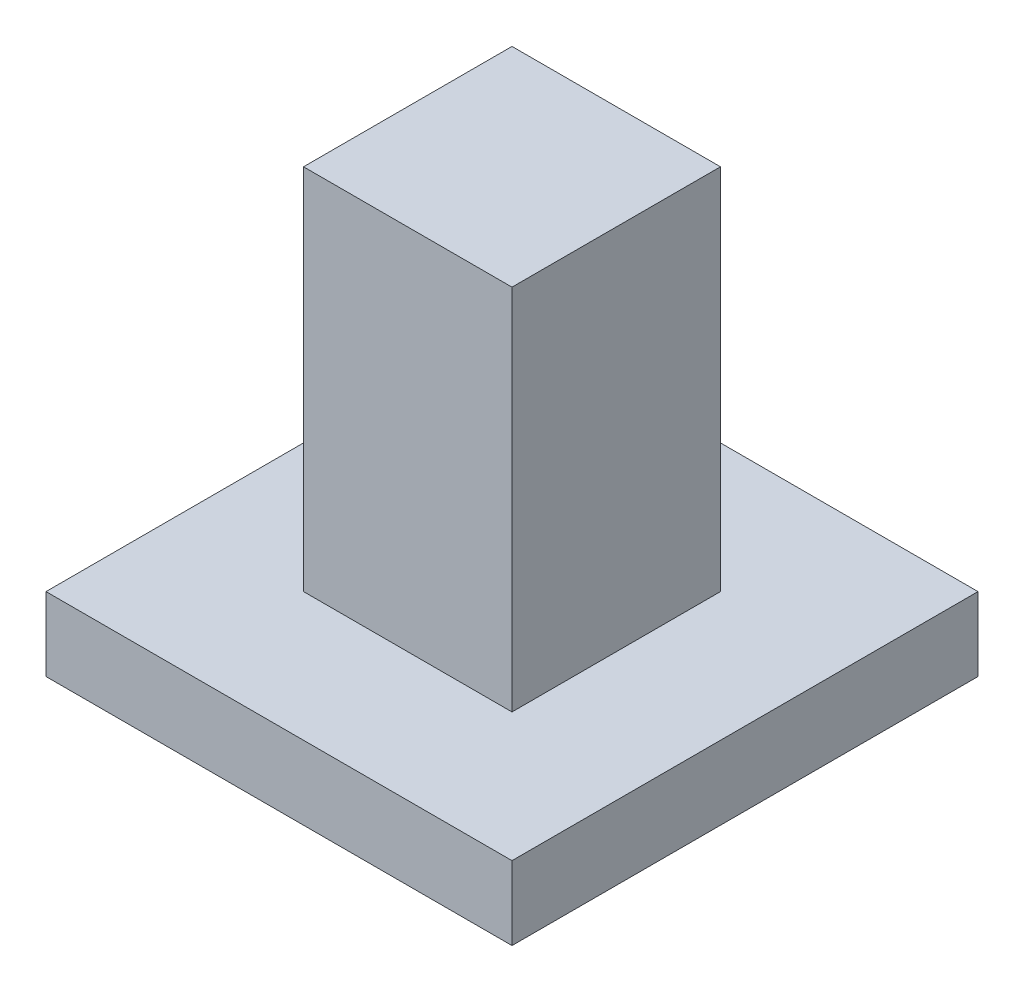
ISO-10303-21;
HEADER;
FILE_DESCRIPTION(('STEP AP214'),'2;1');
FILE_NAME('part.step','',(''),(''),'','','');
FILE_SCHEMA(('AUTOMOTIVE_DESIGN { 1 0 10303 214 1 1 1 1 }'));
ENDSEC;
DATA;
#1=APPLICATION_CONTEXT('core data for automotive mechanical design processes');
#2=APPLICATION_PROTOCOL_DEFINITION('international standard','automotive_design',2000,#1);
#3=PRODUCT_CONTEXT('',#1,'mechanical');
#4=PRODUCT('Part','Part','',(#3));
#5=PRODUCT_RELATED_PRODUCT_CATEGORY('part','',(#4));
#6=PRODUCT_DEFINITION_FORMATION('','',#4);
#7=PRODUCT_DEFINITION_CONTEXT('part definition',#1,'design');
#8=PRODUCT_DEFINITION('design','',#6,#7);
#9=PRODUCT_DEFINITION_SHAPE('','',#8);
#10=(LENGTH_UNIT() NAMED_UNIT(*) SI_UNIT(.MILLI.,.METRE.));
#11=(NAMED_UNIT(*) PLANE_ANGLE_UNIT() SI_UNIT($,.RADIAN.));
#12=(NAMED_UNIT(*) SI_UNIT($,.STERADIAN.) SOLID_ANGLE_UNIT());
#13=UNCERTAINTY_MEASURE_WITH_UNIT(LENGTH_MEASURE(1.E-05),#10,'distance_accuracy_value','');
#14=(GEOMETRIC_REPRESENTATION_CONTEXT(3) GLOBAL_UNCERTAINTY_ASSIGNED_CONTEXT((#13)) GLOBAL_UNIT_ASSIGNED_CONTEXT((#10,
#11,#12)) REPRESENTATION_CONTEXT('',''));
#15=CARTESIAN_POINT('',(0.,0.,0.));
#16=DIRECTION('',(0.,0.,1.));
#17=DIRECTION('',(1.,0.,0.));
#18=AXIS2_PLACEMENT_3D('',#15,#16,#17);
#19=CARTESIAN_POINT('',(0.,1.2,0.));
#20=DIRECTION('',(0.,1.,0.));
#21=DIRECTION('',(0.,0.,1.));
#22=AXIS2_PLACEMENT_3D('',#19,#20,#21);
#23=PLANE('',#22);
#24=DIRECTION('',(0.,0.,-1.));
#25=VECTOR('',#24,1.);
#26=CARTESIAN_POINT('',(0.,1.2,0.));
#27=LINE('',#26,#25);
#28=CARTESIAN_POINT('',(0.,1.2,0.));
#29=VERTEX_POINT('',#28);
#30=CARTESIAN_POINT('',(0.,1.2,-7.6));
#31=VERTEX_POINT('',#30);
#32=EDGE_CURVE('E142',#29,#31,#27,.T.);
#33=ORIENTED_EDGE('',*,*,#32,.T.);
#34=DIRECTION('',(-1.,0.,0.));
#35=VECTOR('',#34,1.);
#36=CARTESIAN_POINT('',(0.,1.2,-7.6));
#37=LINE('',#36,#35);
#38=CARTESIAN_POINT('',(-7.6,1.2,-7.6));
#39=VERTEX_POINT('',#38);
#40=EDGE_CURVE('E87',#31,#39,#37,.T.);
#41=ORIENTED_EDGE('',*,*,#40,.T.);
#42=DIRECTION('',(0.,0.,1.));
#43=VECTOR('',#42,1.);
#44=CARTESIAN_POINT('',(-7.6,1.2,0.));
#45=LINE('',#44,#43);
#46=CARTESIAN_POINT('',(-7.6,1.2,0.));
#47=VERTEX_POINT('',#46);
#48=EDGE_CURVE('E145',#39,#47,#45,.T.);
#49=ORIENTED_EDGE('',*,*,#48,.T.);
#50=DIRECTION('',(1.,0.,0.));
#51=VECTOR('',#50,1.);
#52=CARTESIAN_POINT('',(0.,1.2,0.));
#53=LINE('',#52,#51);
#54=EDGE_CURVE('E59',#47,#29,#53,.T.);
#55=ORIENTED_EDGE('',*,*,#54,.T.);
#56=EDGE_LOOP('',(#33,#41,#49,#55));
#57=FACE_BOUND('',#56,.T.);
#58=DIRECTION('',(1.,0.,0.));
#59=VECTOR('',#58,1.);
#60=CARTESIAN_POINT('',(-5.5,1.2,-2.1));
#61=LINE('',#60,#59);
#62=CARTESIAN_POINT('',(-5.5,1.2,-2.1));
#63=VERTEX_POINT('',#62);
#64=CARTESIAN_POINT('',(-2.1,1.2,-2.1));
#65=VERTEX_POINT('',#64);
#66=EDGE_CURVE('E265',#63,#65,#61,.T.);
#67=ORIENTED_EDGE('',*,*,#66,.F.);
#68=DIRECTION('',(0.,0.,1.));
#69=VECTOR('',#68,1.);
#70=CARTESIAN_POINT('',(-5.5,1.2,-5.5));
#71=LINE('',#70,#69);
#72=CARTESIAN_POINT('',(-5.5,1.2,-5.5));
#73=VERTEX_POINT('',#72);
#74=EDGE_CURVE('E132',#73,#63,#71,.T.);
#75=ORIENTED_EDGE('',*,*,#74,.F.);
#76=DIRECTION('',(-1.,0.,0.));
#77=VECTOR('',#76,1.);
#78=CARTESIAN_POINT('',(-5.5,1.2,-5.5));
#79=LINE('',#78,#77);
#80=CARTESIAN_POINT('',(-2.1,1.2,-5.5));
#81=VERTEX_POINT('',#80);
#82=EDGE_CURVE('E128',#81,#73,#79,.T.);
#83=ORIENTED_EDGE('',*,*,#82,.F.);
#84=DIRECTION('',(0.,0.,-1.));
#85=VECTOR('',#84,1.);
#86=CARTESIAN_POINT('',(-2.1,1.2,-5.5));
#87=LINE('',#86,#85);
#88=EDGE_CURVE('E262',#65,#81,#87,.T.);
#89=ORIENTED_EDGE('',*,*,#88,.F.);
#90=EDGE_LOOP('',(#67,#75,#83,#89));
#91=FACE_BOUND('',#90,.T.);
#92=ADVANCED_FACE('F35',(#57,#91),#23,.T.);
#93=CARTESIAN_POINT('',(0.,1.2,0.));
#94=DIRECTION('',(-1.,0.,0.));
#95=DIRECTION('',(0.,0.,1.));
#96=AXIS2_PLACEMENT_3D('',#93,#94,#95);
#97=PLANE('',#96);
#98=DIRECTION('',(0.,0.,-1.));
#99=VECTOR('',#98,1.);
#100=CARTESIAN_POINT('',(0.,0.,0.));
#101=LINE('',#100,#99);
#102=CARTESIAN_POINT('',(0.,0.,0.));
#103=VERTEX_POINT('',#102);
#104=CARTESIAN_POINT('',(0.,0.,-7.6));
#105=VERTEX_POINT('',#104);
#106=EDGE_CURVE('E134',#103,#105,#101,.T.);
#107=ORIENTED_EDGE('',*,*,#106,.T.);
#108=DIRECTION('',(0.,-1.,0.));
#109=VECTOR('',#108,1.);
#110=CARTESIAN_POINT('',(0.,1.2,-7.6));
#111=LINE('',#110,#109);
#112=EDGE_CURVE('E11',#31,#105,#111,.T.);
#113=ORIENTED_EDGE('',*,*,#112,.F.);
#114=ORIENTED_EDGE('',*,*,#32,.F.);
#115=DIRECTION('',(0.,-1.,0.));
#116=VECTOR('',#115,1.);
#117=CARTESIAN_POINT('',(0.,1.2,0.));
#118=LINE('',#117,#116);
#119=EDGE_CURVE('E147',#29,#103,#118,.T.);
#120=ORIENTED_EDGE('',*,*,#119,.T.);
#121=EDGE_LOOP('',(#107,#113,#114,#120));
#122=FACE_BOUND('',#121,.T.);
#123=ADVANCED_FACE('F37',(#122),#97,.F.);
#124=CARTESIAN_POINT('',(0.,1.2,-7.6));
#125=DIRECTION('',(0.,0.,1.));
#126=DIRECTION('',(1.,0.,0.));
#127=AXIS2_PLACEMENT_3D('',#124,#125,#126);
#128=PLANE('',#127);
#129=DIRECTION('',(-1.,0.,0.));
#130=VECTOR('',#129,1.);
#131=CARTESIAN_POINT('',(0.,0.,-7.6));
#132=LINE('',#131,#130);
#133=CARTESIAN_POINT('',(-7.6,0.,-7.6));
#134=VERTEX_POINT('',#133);
#135=EDGE_CURVE('E137',#105,#134,#132,.T.);
#136=ORIENTED_EDGE('',*,*,#135,.T.);
#137=DIRECTION('',(0.,-1.,0.));
#138=VECTOR('',#137,1.);
#139=CARTESIAN_POINT('',(-7.6,1.2,-7.6));
#140=LINE('',#139,#138);
#141=EDGE_CURVE('E43',#39,#134,#140,.T.);
#142=ORIENTED_EDGE('',*,*,#141,.F.);
#143=ORIENTED_EDGE('',*,*,#40,.F.);
#144=ORIENTED_EDGE('',*,*,#112,.T.);
#145=EDGE_LOOP('',(#136,#142,#143,#144));
#146=FACE_BOUND('',#145,.T.);
#147=ADVANCED_FACE('F175',(#146),#128,.F.);
#148=CARTESIAN_POINT('',(-7.6,1.2,0.));
#149=DIRECTION('',(1.,0.,0.));
#150=DIRECTION('',(0.,0.,-1.));
#151=AXIS2_PLACEMENT_3D('',#148,#149,#150);
#152=PLANE('',#151);
#153=DIRECTION('',(0.,0.,1.));
#154=VECTOR('',#153,1.);
#155=CARTESIAN_POINT('',(-7.6,0.,0.));
#156=LINE('',#155,#154);
#157=CARTESIAN_POINT('',(-7.6,0.,0.));
#158=VERTEX_POINT('',#157);
#159=EDGE_CURVE('E150',#134,#158,#156,.T.);
#160=ORIENTED_EDGE('',*,*,#159,.T.);
#161=DIRECTION('',(0.,-1.,0.));
#162=VECTOR('',#161,1.);
#163=CARTESIAN_POINT('',(-7.6,1.2,0.));
#164=LINE('',#163,#162);
#165=EDGE_CURVE('E154',#47,#158,#164,.T.);
#166=ORIENTED_EDGE('',*,*,#165,.F.);
#167=ORIENTED_EDGE('',*,*,#48,.F.);
#168=ORIENTED_EDGE('',*,*,#141,.T.);
#169=EDGE_LOOP('',(#160,#166,#167,#168));
#170=FACE_BOUND('',#169,.T.);
#171=ADVANCED_FACE('F159',(#170),#152,.F.);
#172=CARTESIAN_POINT('',(0.,1.2,0.));
#173=DIRECTION('',(0.,0.,-1.));
#174=DIRECTION('',(-1.,0.,0.));
#175=AXIS2_PLACEMENT_3D('',#172,#173,#174);
#176=PLANE('',#175);
#177=DIRECTION('',(1.,0.,0.));
#178=VECTOR('',#177,1.);
#179=CARTESIAN_POINT('',(0.,0.,0.));
#180=LINE('',#179,#178);
#181=EDGE_CURVE('E80',#158,#103,#180,.T.);
#182=ORIENTED_EDGE('',*,*,#181,.T.);
#183=ORIENTED_EDGE('',*,*,#119,.F.);
#184=ORIENTED_EDGE('',*,*,#54,.F.);
#185=ORIENTED_EDGE('',*,*,#165,.T.);
#186=EDGE_LOOP('',(#182,#183,#184,#185));
#187=FACE_BOUND('',#186,.T.);
#188=ADVANCED_FACE('F167',(#187),#176,.F.);
#189=CARTESIAN_POINT('',(0.,0.,0.));
#190=DIRECTION('',(0.,1.,0.));
#191=DIRECTION('',(0.,0.,1.));
#192=AXIS2_PLACEMENT_3D('',#189,#190,#191);
#193=PLANE('',#192);
#194=ORIENTED_EDGE('',*,*,#106,.F.);
#195=ORIENTED_EDGE('',*,*,#181,.F.);
#196=ORIENTED_EDGE('',*,*,#159,.F.);
#197=ORIENTED_EDGE('',*,*,#135,.F.);
#198=EDGE_LOOP('',(#194,#195,#196,#197));
#199=FACE_BOUND('',#198,.T.);
#200=ADVANCED_FACE('F163',(#199),#193,.F.);
#201=CARTESIAN_POINT('',(-5.5,7.2,-5.5));
#202=DIRECTION('',(1.,0.,0.));
#203=DIRECTION('',(0.,0.,-1.));
#204=AXIS2_PLACEMENT_3D('',#201,#202,#203);
#205=PLANE('',#204);
#206=ORIENTED_EDGE('',*,*,#74,.T.);
#207=DIRECTION('',(0.,-1.,0.));
#208=VECTOR('',#207,1.);
#209=CARTESIAN_POINT('',(-5.5,7.2,-2.1));
#210=LINE('',#209,#208);
#211=CARTESIAN_POINT('',(-5.5,7.2,-2.1));
#212=VERTEX_POINT('',#211);
#213=EDGE_CURVE('E113',#212,#63,#210,.T.);
#214=ORIENTED_EDGE('',*,*,#213,.F.);
#215=DIRECTION('',(0.,0.,1.));
#216=VECTOR('',#215,1.);
#217=CARTESIAN_POINT('',(-5.5,7.2,-5.5));
#218=LINE('',#217,#216);
#219=CARTESIAN_POINT('',(-5.5,7.2,-5.5));
#220=VERTEX_POINT('',#219);
#221=EDGE_CURVE('E120',#220,#212,#218,.T.);
#222=ORIENTED_EDGE('',*,*,#221,.F.);
#223=DIRECTION('',(0.,-1.,0.));
#224=VECTOR('',#223,1.);
#225=CARTESIAN_POINT('',(-5.5,7.2,-5.5));
#226=LINE('',#225,#224);
#227=EDGE_CURVE('E260',#220,#73,#226,.T.);
#228=ORIENTED_EDGE('',*,*,#227,.T.);
#229=EDGE_LOOP('',(#206,#214,#222,#228));
#230=FACE_BOUND('',#229,.T.);
#231=ADVANCED_FACE('F130',(#230),#205,.F.);
#232=CARTESIAN_POINT('',(-5.5,7.2,-2.1));
#233=DIRECTION('',(0.,0.,-1.));
#234=DIRECTION('',(-1.,0.,0.));
#235=AXIS2_PLACEMENT_3D('',#232,#233,#234);
#236=PLANE('',#235);
#237=ORIENTED_EDGE('',*,*,#66,.T.);
#238=DIRECTION('',(0.,-1.,0.));
#239=VECTOR('',#238,1.);
#240=CARTESIAN_POINT('',(-2.1,7.2,-2.1));
#241=LINE('',#240,#239);
#242=CARTESIAN_POINT('',(-2.1,7.2,-2.1));
#243=VERTEX_POINT('',#242);
#244=EDGE_CURVE('E116',#243,#65,#241,.T.);
#245=ORIENTED_EDGE('',*,*,#244,.F.);
#246=DIRECTION('',(1.,0.,0.));
#247=VECTOR('',#246,1.);
#248=CARTESIAN_POINT('',(-5.5,7.2,-2.1));
#249=LINE('',#248,#247);
#250=EDGE_CURVE('E109',#212,#243,#249,.T.);
#251=ORIENTED_EDGE('',*,*,#250,.F.);
#252=ORIENTED_EDGE('',*,*,#213,.T.);
#253=EDGE_LOOP('',(#237,#245,#251,#252));
#254=FACE_BOUND('',#253,.T.);
#255=ADVANCED_FACE('F111',(#254),#236,.F.);
#256=CARTESIAN_POINT('',(-2.1,7.2,-5.5));
#257=DIRECTION('',(-1.,0.,0.));
#258=DIRECTION('',(0.,0.,1.));
#259=AXIS2_PLACEMENT_3D('',#256,#257,#258);
#260=PLANE('',#259);
#261=ORIENTED_EDGE('',*,*,#88,.T.);
#262=DIRECTION('',(0.,-1.,0.));
#263=VECTOR('',#262,1.);
#264=CARTESIAN_POINT('',(-2.1,7.2,-5.5));
#265=LINE('',#264,#263);
#266=CARTESIAN_POINT('',(-2.1,7.2,-5.5));
#267=VERTEX_POINT('',#266);
#268=EDGE_CURVE('E50',#267,#81,#265,.T.);
#269=ORIENTED_EDGE('',*,*,#268,.F.);
#270=DIRECTION('',(0.,0.,-1.));
#271=VECTOR('',#270,1.);
#272=CARTESIAN_POINT('',(-2.1,7.2,-5.5));
#273=LINE('',#272,#271);
#274=EDGE_CURVE('E119',#243,#267,#273,.T.);
#275=ORIENTED_EDGE('',*,*,#274,.F.);
#276=ORIENTED_EDGE('',*,*,#244,.T.);
#277=EDGE_LOOP('',(#261,#269,#275,#276));
#278=FACE_BOUND('',#277,.T.);
#279=ADVANCED_FACE('F188',(#278),#260,.F.);
#280=CARTESIAN_POINT('',(-5.5,7.2,-5.5));
#281=DIRECTION('',(0.,0.,1.));
#282=DIRECTION('',(1.,0.,0.));
#283=AXIS2_PLACEMENT_3D('',#280,#281,#282);
#284=PLANE('',#283);
#285=ORIENTED_EDGE('',*,*,#82,.T.);
#286=ORIENTED_EDGE('',*,*,#227,.F.);
#287=DIRECTION('',(-1.,0.,0.));
#288=VECTOR('',#287,1.);
#289=CARTESIAN_POINT('',(-5.5,7.2,-5.5));
#290=LINE('',#289,#288);
#291=EDGE_CURVE('E124',#267,#220,#290,.T.);
#292=ORIENTED_EDGE('',*,*,#291,.F.);
#293=ORIENTED_EDGE('',*,*,#268,.T.);
#294=EDGE_LOOP('',(#285,#286,#292,#293));
#295=FACE_BOUND('',#294,.T.);
#296=ADVANCED_FACE('F191',(#295),#284,.F.);
#297=CARTESIAN_POINT('',(0.,7.2,0.));
#298=DIRECTION('',(0.,1.,0.));
#299=DIRECTION('',(0.,0.,1.));
#300=AXIS2_PLACEMENT_3D('',#297,#298,#299);
#301=PLANE('',#300);
#302=ORIENTED_EDGE('',*,*,#221,.T.);
#303=ORIENTED_EDGE('',*,*,#250,.T.);
#304=ORIENTED_EDGE('',*,*,#274,.T.);
#305=ORIENTED_EDGE('',*,*,#291,.T.);
#306=EDGE_LOOP('',(#302,#303,#304,#305));
#307=FACE_BOUND('',#306,.T.);
#308=ADVANCED_FACE('F123',(#307),#301,.T.);
#309=CLOSED_SHELL('',(#92,#123,#147,#171,#188,#200,#231,#255,#279,#296,#308));
#310=MANIFOLD_SOLID_BREP('B2',#309);
#311=ADVANCED_BREP_SHAPE_REPRESENTATION('',(#18,#310),#14);
#312=SHAPE_DEFINITION_REPRESENTATION(#9,#311);
ENDSEC;
END-ISO-10303-21;
